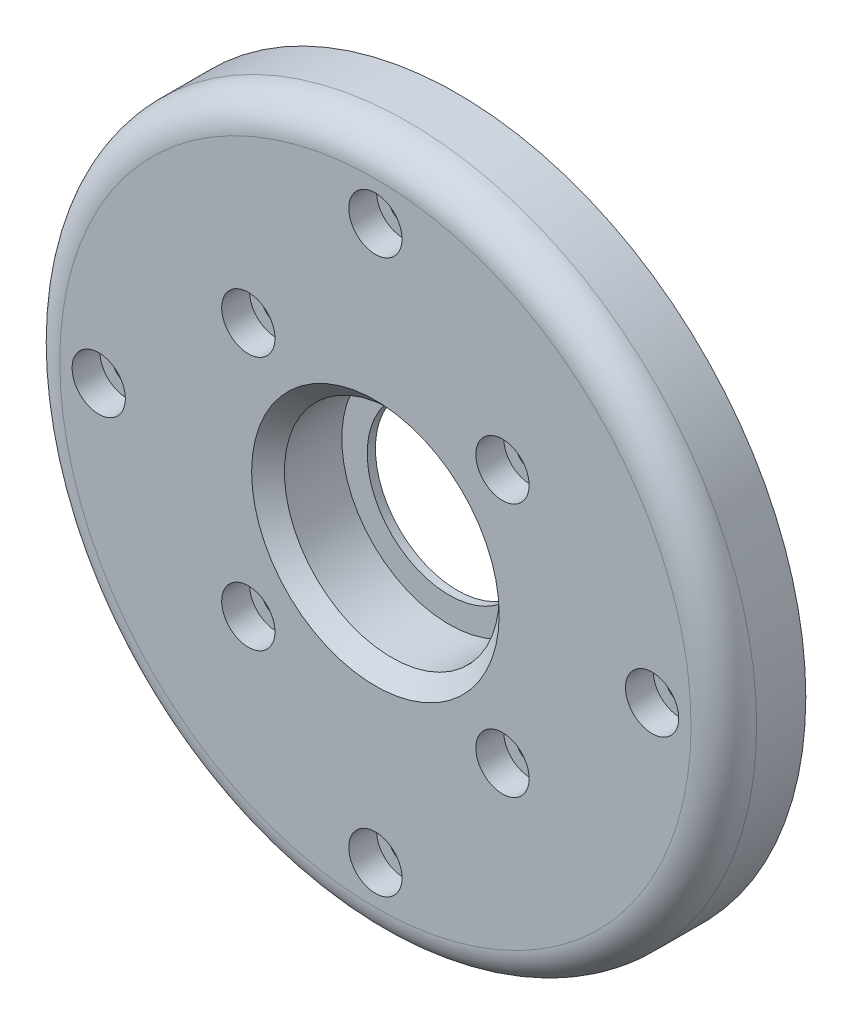
ISO-10303-21;
HEADER;
FILE_DESCRIPTION(('STEP AP214'),'2;1');
FILE_NAME('part.step','',(''),(''),'','','');
FILE_SCHEMA(('AUTOMOTIVE_DESIGN { 1 0 10303 214 1 1 1 1 }'));
ENDSEC;
DATA;
#1=APPLICATION_CONTEXT('core data for automotive mechanical design processes');
#2=APPLICATION_PROTOCOL_DEFINITION('international standard','automotive_design',2000,#1);
#3=PRODUCT_CONTEXT('',#1,'mechanical');
#4=PRODUCT('Part','Part','',(#3));
#5=PRODUCT_RELATED_PRODUCT_CATEGORY('part','',(#4));
#6=PRODUCT_DEFINITION_FORMATION('','',#4);
#7=PRODUCT_DEFINITION_CONTEXT('part definition',#1,'design');
#8=PRODUCT_DEFINITION('design','',#6,#7);
#9=PRODUCT_DEFINITION_SHAPE('','',#8);
#10=(LENGTH_UNIT() NAMED_UNIT(*) SI_UNIT(.MILLI.,.METRE.));
#11=(NAMED_UNIT(*) PLANE_ANGLE_UNIT() SI_UNIT($,.RADIAN.));
#12=(NAMED_UNIT(*) SI_UNIT($,.STERADIAN.) SOLID_ANGLE_UNIT());
#13=UNCERTAINTY_MEASURE_WITH_UNIT(LENGTH_MEASURE(1.E-05),#10,'distance_accuracy_value','');
#14=(GEOMETRIC_REPRESENTATION_CONTEXT(3) GLOBAL_UNCERTAINTY_ASSIGNED_CONTEXT((#13)) GLOBAL_UNIT_ASSIGNED_CONTEXT((#10,
#11,#12)) REPRESENTATION_CONTEXT('',''));
#15=CARTESIAN_POINT('',(0.,0.,0.));
#16=DIRECTION('',(0.,0.,1.));
#17=DIRECTION('',(1.,0.,0.));
#18=AXIS2_PLACEMENT_3D('',#15,#16,#17);
#19=CARTESIAN_POINT('',(0.,0.,-28.2842712474619));
#20=DIRECTION('',(0.,0.,1.));
#21=DIRECTION('',(1.,0.,0.));
#22=AXIS2_PLACEMENT_3D('',#19,#20,#21);
#23=CYLINDRICAL_SURFACE('',#22,10.);
#24=CARTESIAN_POINT('',(0.,0.,0.));
#25=DIRECTION('',(0.,0.,1.));
#26=DIRECTION('',(1.,0.,0.));
#27=AXIS2_PLACEMENT_3D('',#24,#25,#26);
#28=CIRCLE('',#27,10.);
#29=CARTESIAN_POINT('',(10.,0.,0.));
#30=VERTEX_POINT('',#29);
#31=EDGE_CURVE('E68',#30,#30,#28,.F.);
#32=ORIENTED_EDGE('',*,*,#31,.T.);
#33=EDGE_LOOP('',(#32));
#34=FACE_BOUND('',#33,.T.);
#35=CARTESIAN_POINT('',(0.,0.,1.));
#36=DIRECTION('',(0.,0.,1.));
#37=DIRECTION('',(1.,0.,0.));
#38=AXIS2_PLACEMENT_3D('',#35,#36,#37);
#39=CIRCLE('',#38,10.);
#40=CARTESIAN_POINT('',(10.,0.,1.));
#41=VERTEX_POINT('',#40);
#42=EDGE_CURVE('E61',#41,#41,#39,.F.);
#43=ORIENTED_EDGE('',*,*,#42,.F.);
#44=EDGE_LOOP('',(#43));
#45=FACE_BOUND('',#44,.T.);
#46=ADVANCED_FACE('F39',(#34,#45),#23,.F.);
#47=CARTESIAN_POINT('',(0.,0.,10.));
#48=DIRECTION('',(0.,0.,-1.));
#49=DIRECTION('',(-1.,0.,0.));
#50=AXIS2_PLACEMENT_3D('',#47,#48,#49);
#51=CYLINDRICAL_SURFACE('',#50,42.5);
#52=CARTESIAN_POINT('',(0.,0.,6.));
#53=DIRECTION('',(0.,0.,1.));
#54=DIRECTION('',(1.,0.,0.));
#55=AXIS2_PLACEMENT_3D('',#52,#53,#54);
#56=CIRCLE('',#55,42.5);
#57=CARTESIAN_POINT('',(42.5,0.,6.));
#58=VERTEX_POINT('',#57);
#59=EDGE_CURVE('E51',#58,#58,#56,.F.);
#60=ORIENTED_EDGE('',*,*,#59,.T.);
#61=EDGE_LOOP('',(#60));
#62=FACE_BOUND('',#61,.T.);
#63=CARTESIAN_POINT('',(0.,0.,0.));
#64=DIRECTION('',(0.,0.,1.));
#65=DIRECTION('',(1.,0.,0.));
#66=AXIS2_PLACEMENT_3D('',#63,#64,#65);
#67=CIRCLE('',#66,42.5);
#68=CARTESIAN_POINT('',(42.5,0.,0.));
#69=VERTEX_POINT('',#68);
#70=EDGE_CURVE('E60',#69,#69,#67,.T.);
#71=ORIENTED_EDGE('',*,*,#70,.T.);
#72=EDGE_LOOP('',(#71));
#73=FACE_BOUND('',#72,.T.);
#74=ADVANCED_FACE('F187',(#62,#73),#51,.T.);
#75=CARTESIAN_POINT('',(0.,0.,10.));
#76=DIRECTION('',(0.,0.,1.));
#77=DIRECTION('',(1.,0.,0.));
#78=AXIS2_PLACEMENT_3D('',#75,#76,#77);
#79=PLANE('',#78);
#80=CARTESIAN_POINT('',(0.,0.,10.));
#81=DIRECTION('',(0.,0.,1.));
#82=DIRECTION('',(1.,0.,0.));
#83=AXIS2_PLACEMENT_3D('',#80,#81,#82);
#84=CIRCLE('',#83,15.1);
#85=CARTESIAN_POINT('',(15.1,0.,10.));
#86=VERTEX_POINT('',#85);
#87=EDGE_CURVE('E10',#86,#86,#84,.F.);
#88=ORIENTED_EDGE('',*,*,#87,.T.);
#89=EDGE_LOOP('',(#88));
#90=FACE_BOUND('',#89,.T.);
#91=CARTESIAN_POINT('',(0.,0.,10.));
#92=DIRECTION('',(0.,0.,1.));
#93=DIRECTION('',(1.,0.,0.));
#94=AXIS2_PLACEMENT_3D('',#91,#92,#93);
#95=CIRCLE('',#94,38.5);
#96=CARTESIAN_POINT('',(38.5,0.,10.));
#97=VERTEX_POINT('',#96);
#98=EDGE_CURVE('E55',#97,#97,#95,.T.);
#99=ORIENTED_EDGE('',*,*,#98,.T.);
#100=EDGE_LOOP('',(#99));
#101=FACE_BOUND('',#100,.T.);
#102=CARTESIAN_POINT('',(-3.49379302610745E-13,-33.75,10.));
#103=DIRECTION('',(0.,0.,1.));
#104=DIRECTION('',(0.,1.,0.));
#105=AXIS2_PLACEMENT_3D('',#102,#103,#104);
#106=CIRCLE('',#105,3.25);
#107=CARTESIAN_POINT('',(-3.15337359557024E-13,-30.5,10.));
#108=VERTEX_POINT('',#107);
#109=EDGE_CURVE('E102',#108,#108,#106,.T.);
#110=ORIENTED_EDGE('',*,*,#109,.F.);
#111=EDGE_LOOP('',(#110));
#112=FACE_BOUND('',#111,.T.);
#113=CARTESIAN_POINT('',(1.13704312238833E-13,33.75,10.));
#114=DIRECTION('',(0.,0.,1.));
#115=DIRECTION('',(0.,-1.,0.));
#116=AXIS2_PLACEMENT_3D('',#113,#114,#115);
#117=CIRCLE('',#116,3.25);
#118=CARTESIAN_POINT('',(1.02356997887593E-13,30.5,10.));
#119=VERTEX_POINT('',#118);
#120=EDGE_CURVE('E117',#119,#119,#117,.T.);
#121=ORIENTED_EDGE('',*,*,#120,.F.);
#122=EDGE_LOOP('',(#121));
#123=FACE_BOUND('',#122,.T.);
#124=CARTESIAN_POINT('',(15.5,-15.5,10.));
#125=DIRECTION('',(0.,0.,1.));
#126=DIRECTION('',(-1.,0.,0.));
#127=AXIS2_PLACEMENT_3D('',#124,#125,#126);
#128=CIRCLE('',#127,3.25);
#129=CARTESIAN_POINT('',(12.25,-15.5,10.));
#130=VERTEX_POINT('',#129);
#131=EDGE_CURVE('E110',#130,#130,#128,.T.);
#132=ORIENTED_EDGE('',*,*,#131,.F.);
#133=EDGE_LOOP('',(#132));
#134=FACE_BOUND('',#133,.T.);
#135=CARTESIAN_POINT('',(33.75,0.,10.));
#136=DIRECTION('',(0.,0.,1.));
#137=DIRECTION('',(-1.,0.,0.));
#138=AXIS2_PLACEMENT_3D('',#135,#136,#137);
#139=CIRCLE('',#138,3.25);
#140=CARTESIAN_POINT('',(30.5,0.,10.));
#141=VERTEX_POINT('',#140);
#142=EDGE_CURVE('E127',#141,#141,#139,.T.);
#143=ORIENTED_EDGE('',*,*,#142,.F.);
#144=EDGE_LOOP('',(#143));
#145=FACE_BOUND('',#144,.T.);
#146=CARTESIAN_POINT('',(-15.5000000000002,-15.4999999999998,10.));
#147=DIRECTION('',(0.,0.,1.));
#148=DIRECTION('',(0.,1.,0.));
#149=AXIS2_PLACEMENT_3D('',#146,#147,#148);
#150=CIRCLE('',#149,3.25);
#151=CARTESIAN_POINT('',(-15.5000000000001,-12.2499999999998,10.));
#152=VERTEX_POINT('',#151);
#153=EDGE_CURVE('E109',#152,#152,#150,.T.);
#154=ORIENTED_EDGE('',*,*,#153,.F.);
#155=EDGE_LOOP('',(#154));
#156=FACE_BOUND('',#155,.T.);
#157=CARTESIAN_POINT('',(15.5000000000001,15.4999999999999,10.));
#158=DIRECTION('',(0.,0.,1.));
#159=DIRECTION('',(0.,-1.,0.));
#160=AXIS2_PLACEMENT_3D('',#157,#158,#159);
#161=CIRCLE('',#160,3.25);
#162=CARTESIAN_POINT('',(15.5,12.2499999999999,10.));
#163=VERTEX_POINT('',#162);
#164=EDGE_CURVE('E96',#163,#163,#161,.T.);
#165=ORIENTED_EDGE('',*,*,#164,.F.);
#166=EDGE_LOOP('',(#165));
#167=FACE_BOUND('',#166,.T.);
#168=CARTESIAN_POINT('',(-15.5,15.5,10.));
#169=DIRECTION('',(0.,0.,1.));
#170=DIRECTION('',(1.,0.,0.));
#171=AXIS2_PLACEMENT_3D('',#168,#169,#170);
#172=CIRCLE('',#171,3.25);
#173=CARTESIAN_POINT('',(-12.25,15.5,10.));
#174=VERTEX_POINT('',#173);
#175=EDGE_CURVE('E79',#174,#174,#172,.T.);
#176=ORIENTED_EDGE('',*,*,#175,.F.);
#177=EDGE_LOOP('',(#176));
#178=FACE_BOUND('',#177,.T.);
#179=CARTESIAN_POINT('',(-33.75,0.,10.));
#180=DIRECTION('',(0.,0.,1.));
#181=DIRECTION('',(1.,0.,0.));
#182=AXIS2_PLACEMENT_3D('',#179,#180,#181);
#183=CIRCLE('',#182,3.25);
#184=CARTESIAN_POINT('',(-30.5,0.,10.));
#185=VERTEX_POINT('',#184);
#186=EDGE_CURVE('E75',#185,#185,#183,.T.);
#187=ORIENTED_EDGE('',*,*,#186,.F.);
#188=EDGE_LOOP('',(#187));
#189=FACE_BOUND('',#188,.T.);
#190=ADVANCED_FACE('F194',(#90,#101,#112,#123,#134,#145,#156,#167,#178,#189),#79,.T.);
#191=CARTESIAN_POINT('',(0.,0.,0.));
#192=DIRECTION('',(0.,0.,1.));
#193=DIRECTION('',(1.,0.,0.));
#194=AXIS2_PLACEMENT_3D('',#191,#192,#193);
#195=PLANE('',#194);
#196=CARTESIAN_POINT('',(-3.49379302610745E-13,-33.75,0.));
#197=DIRECTION('',(0.,0.,1.));
#198=DIRECTION('',(1.,0.,0.));
#199=AXIS2_PLACEMENT_3D('',#196,#197,#198);
#200=CIRCLE('',#199,1.7);
#201=CARTESIAN_POINT('',(1.69999999999965,-33.75,0.));
#202=VERTEX_POINT('',#201);
#203=EDGE_CURVE('E138',#202,#202,#200,.F.);
#204=ORIENTED_EDGE('',*,*,#203,.F.);
#205=EDGE_LOOP('',(#204));
#206=FACE_BOUND('',#205,.T.);
#207=CARTESIAN_POINT('',(1.13704312238833E-13,33.75,0.));
#208=DIRECTION('',(0.,0.,1.));
#209=DIRECTION('',(1.,0.,0.));
#210=AXIS2_PLACEMENT_3D('',#207,#208,#209);
#211=CIRCLE('',#210,1.7);
#212=CARTESIAN_POINT('',(1.70000000000011,33.75,0.));
#213=VERTEX_POINT('',#212);
#214=EDGE_CURVE('E137',#213,#213,#211,.F.);
#215=ORIENTED_EDGE('',*,*,#214,.F.);
#216=EDGE_LOOP('',(#215));
#217=FACE_BOUND('',#216,.T.);
#218=CARTESIAN_POINT('',(15.5,-15.5,0.));
#219=DIRECTION('',(0.,0.,1.));
#220=DIRECTION('',(1.,0.,0.));
#221=AXIS2_PLACEMENT_3D('',#218,#219,#220);
#222=CIRCLE('',#221,1.7);
#223=CARTESIAN_POINT('',(17.2,-15.5,0.));
#224=VERTEX_POINT('',#223);
#225=EDGE_CURVE('E144',#224,#224,#222,.F.);
#226=ORIENTED_EDGE('',*,*,#225,.F.);
#227=EDGE_LOOP('',(#226));
#228=FACE_BOUND('',#227,.T.);
#229=CARTESIAN_POINT('',(33.75,0.,0.));
#230=DIRECTION('',(0.,0.,1.));
#231=DIRECTION('',(1.,0.,0.));
#232=AXIS2_PLACEMENT_3D('',#229,#230,#231);
#233=CIRCLE('',#232,1.7);
#234=CARTESIAN_POINT('',(35.45,0.,0.));
#235=VERTEX_POINT('',#234);
#236=EDGE_CURVE('E151',#235,#235,#233,.F.);
#237=ORIENTED_EDGE('',*,*,#236,.F.);
#238=EDGE_LOOP('',(#237));
#239=FACE_BOUND('',#238,.T.);
#240=CARTESIAN_POINT('',(-15.5000000000002,-15.4999999999998,0.));
#241=DIRECTION('',(0.,0.,1.));
#242=DIRECTION('',(1.,0.,0.));
#243=AXIS2_PLACEMENT_3D('',#240,#241,#242);
#244=CIRCLE('',#243,1.7);
#245=CARTESIAN_POINT('',(-13.8000000000002,-15.4999999999998,0.));
#246=VERTEX_POINT('',#245);
#247=EDGE_CURVE('E156',#246,#246,#244,.F.);
#248=ORIENTED_EDGE('',*,*,#247,.F.);
#249=EDGE_LOOP('',(#248));
#250=FACE_BOUND('',#249,.T.);
#251=CARTESIAN_POINT('',(15.5000000000001,15.4999999999999,0.));
#252=DIRECTION('',(0.,0.,1.));
#253=DIRECTION('',(1.,0.,0.));
#254=AXIS2_PLACEMENT_3D('',#251,#252,#253);
#255=CIRCLE('',#254,1.7);
#256=CARTESIAN_POINT('',(17.2000000000001,15.4999999999999,0.));
#257=VERTEX_POINT('',#256);
#258=EDGE_CURVE('E106',#257,#257,#255,.F.);
#259=ORIENTED_EDGE('',*,*,#258,.F.);
#260=EDGE_LOOP('',(#259));
#261=FACE_BOUND('',#260,.T.);
#262=CARTESIAN_POINT('',(-15.5,15.5,0.));
#263=DIRECTION('',(0.,0.,1.));
#264=DIRECTION('',(1.,0.,0.));
#265=AXIS2_PLACEMENT_3D('',#262,#263,#264);
#266=CIRCLE('',#265,1.7);
#267=CARTESIAN_POINT('',(-13.8,15.5,0.));
#268=VERTEX_POINT('',#267);
#269=EDGE_CURVE('E76',#268,#268,#266,.F.);
#270=ORIENTED_EDGE('',*,*,#269,.F.);
#271=EDGE_LOOP('',(#270));
#272=FACE_BOUND('',#271,.T.);
#273=CARTESIAN_POINT('',(-33.75,0.,0.));
#274=DIRECTION('',(0.,0.,1.));
#275=DIRECTION('',(1.,0.,0.));
#276=AXIS2_PLACEMENT_3D('',#273,#274,#275);
#277=CIRCLE('',#276,1.7);
#278=CARTESIAN_POINT('',(-32.05,0.,0.));
#279=VERTEX_POINT('',#278);
#280=EDGE_CURVE('E88',#279,#279,#277,.F.);
#281=ORIENTED_EDGE('',*,*,#280,.F.);
#282=EDGE_LOOP('',(#281));
#283=FACE_BOUND('',#282,.T.);
#284=ORIENTED_EDGE('',*,*,#31,.F.);
#285=EDGE_LOOP('',(#284));
#286=FACE_BOUND('',#285,.T.);
#287=ORIENTED_EDGE('',*,*,#70,.F.);
#288=EDGE_LOOP('',(#287));
#289=FACE_BOUND('',#288,.T.);
#290=ADVANCED_FACE('F203',(#206,#217,#228,#239,#250,#261,#272,#283,#286,#289),#195,.F.);
#291=CARTESIAN_POINT('',(-33.75,0.,6.6));
#292=DIRECTION('',(0.,0.,1.));
#293=DIRECTION('',(1.,0.,0.));
#294=AXIS2_PLACEMENT_3D('',#291,#292,#293);
#295=CYLINDRICAL_SURFACE('',#294,3.25);
#296=CARTESIAN_POINT('',(-33.75,0.,6.6));
#297=DIRECTION('',(0.,0.,1.));
#298=DIRECTION('',(1.,0.,0.));
#299=AXIS2_PLACEMENT_3D('',#296,#297,#298);
#300=CIRCLE('',#299,3.25);
#301=CARTESIAN_POINT('',(-30.5,0.,6.6));
#302=VERTEX_POINT('',#301);
#303=EDGE_CURVE('E72',#302,#302,#300,.T.);
#304=ORIENTED_EDGE('',*,*,#303,.F.);
#305=EDGE_LOOP('',(#304));
#306=FACE_BOUND('',#305,.T.);
#307=ORIENTED_EDGE('',*,*,#186,.T.);
#308=EDGE_LOOP('',(#307));
#309=FACE_BOUND('',#308,.T.);
#310=ADVANCED_FACE('F205',(#306,#309),#295,.F.);
#311=CARTESIAN_POINT('',(-33.75,0.,6.6));
#312=DIRECTION('',(0.,0.,1.));
#313=DIRECTION('',(1.,0.,0.));
#314=AXIS2_PLACEMENT_3D('',#311,#312,#313);
#315=PLANE('',#314);
#316=CARTESIAN_POINT('',(-33.75,0.,6.6));
#317=DIRECTION('',(0.,0.,1.));
#318=DIRECTION('',(1.,0.,0.));
#319=AXIS2_PLACEMENT_3D('',#316,#317,#318);
#320=CIRCLE('',#319,1.7);
#321=CARTESIAN_POINT('',(-32.05,0.,6.6));
#322=VERTEX_POINT('',#321);
#323=EDGE_CURVE('E84',#322,#322,#320,.T.);
#324=ORIENTED_EDGE('',*,*,#323,.F.);
#325=EDGE_LOOP('',(#324));
#326=FACE_BOUND('',#325,.T.);
#327=ORIENTED_EDGE('',*,*,#303,.T.);
#328=EDGE_LOOP('',(#327));
#329=FACE_BOUND('',#328,.T.);
#330=ADVANCED_FACE('F200',(#326,#329),#315,.T.);
#331=CARTESIAN_POINT('',(-15.5,15.5,6.6));
#332=DIRECTION('',(0.,0.,1.));
#333=DIRECTION('',(1.,0.,0.));
#334=AXIS2_PLACEMENT_3D('',#331,#332,#333);
#335=CYLINDRICAL_SURFACE('',#334,3.25);
#336=CARTESIAN_POINT('',(-15.5,15.5,6.6));
#337=DIRECTION('',(0.,0.,1.));
#338=DIRECTION('',(1.,0.,0.));
#339=AXIS2_PLACEMENT_3D('',#336,#337,#338);
#340=CIRCLE('',#339,3.25);
#341=CARTESIAN_POINT('',(-12.25,15.5,6.6));
#342=VERTEX_POINT('',#341);
#343=EDGE_CURVE('E71',#342,#342,#340,.T.);
#344=ORIENTED_EDGE('',*,*,#343,.F.);
#345=EDGE_LOOP('',(#344));
#346=FACE_BOUND('',#345,.T.);
#347=ORIENTED_EDGE('',*,*,#175,.T.);
#348=EDGE_LOOP('',(#347));
#349=FACE_BOUND('',#348,.T.);
#350=ADVANCED_FACE('F244',(#346,#349),#335,.F.);
#351=CARTESIAN_POINT('',(-15.5,15.5,6.6));
#352=DIRECTION('',(0.,0.,1.));
#353=DIRECTION('',(1.,0.,0.));
#354=AXIS2_PLACEMENT_3D('',#351,#352,#353);
#355=PLANE('',#354);
#356=CARTESIAN_POINT('',(-15.5,15.5,6.6));
#357=DIRECTION('',(0.,0.,1.));
#358=DIRECTION('',(1.,0.,0.));
#359=AXIS2_PLACEMENT_3D('',#356,#357,#358);
#360=CIRCLE('',#359,1.7);
#361=CARTESIAN_POINT('',(-13.8,15.5,6.6));
#362=VERTEX_POINT('',#361);
#363=EDGE_CURVE('E87',#362,#362,#360,.T.);
#364=ORIENTED_EDGE('',*,*,#363,.F.);
#365=EDGE_LOOP('',(#364));
#366=FACE_BOUND('',#365,.T.);
#367=ORIENTED_EDGE('',*,*,#343,.T.);
#368=EDGE_LOOP('',(#367));
#369=FACE_BOUND('',#368,.T.);
#370=ADVANCED_FACE('F238',(#366,#369),#355,.T.);
#371=CARTESIAN_POINT('',(-33.75,0.,-4.80832611206852));
#372=DIRECTION('',(0.,0.,1.));
#373=DIRECTION('',(1.,0.,0.));
#374=AXIS2_PLACEMENT_3D('',#371,#372,#373);
#375=CYLINDRICAL_SURFACE('',#374,1.7);
#376=ORIENTED_EDGE('',*,*,#280,.T.);
#377=EDGE_LOOP('',(#376));
#378=FACE_BOUND('',#377,.T.);
#379=ORIENTED_EDGE('',*,*,#323,.T.);
#380=EDGE_LOOP('',(#379));
#381=FACE_BOUND('',#380,.T.);
#382=ADVANCED_FACE('F234',(#378,#381),#375,.F.);
#383=CARTESIAN_POINT('',(-15.5,15.5,-4.80832611206852));
#384=DIRECTION('',(0.,0.,1.));
#385=DIRECTION('',(1.,0.,0.));
#386=AXIS2_PLACEMENT_3D('',#383,#384,#385);
#387=CYLINDRICAL_SURFACE('',#386,1.7);
#388=ORIENTED_EDGE('',*,*,#269,.T.);
#389=EDGE_LOOP('',(#388));
#390=FACE_BOUND('',#389,.T.);
#391=ORIENTED_EDGE('',*,*,#363,.T.);
#392=EDGE_LOOP('',(#391));
#393=FACE_BOUND('',#392,.T.);
#394=ADVANCED_FACE('F237',(#390,#393),#387,.F.);
#395=CARTESIAN_POINT('',(15.5000000000001,15.4999999999999,6.6));
#396=DIRECTION('',(0.,0.,1.));
#397=DIRECTION('',(1.,0.,0.));
#398=AXIS2_PLACEMENT_3D('',#395,#396,#397);
#399=CYLINDRICAL_SURFACE('',#398,3.25);
#400=CARTESIAN_POINT('',(15.5000000000001,15.4999999999999,6.6));
#401=DIRECTION('',(0.,0.,1.));
#402=DIRECTION('',(0.,-1.,0.));
#403=AXIS2_PLACEMENT_3D('',#400,#401,#402);
#404=CIRCLE('',#403,3.25);
#405=CARTESIAN_POINT('',(15.5,12.2499999999999,6.6));
#406=VERTEX_POINT('',#405);
#407=EDGE_CURVE('E91',#406,#406,#404,.T.);
#408=ORIENTED_EDGE('',*,*,#407,.F.);
#409=EDGE_LOOP('',(#408));
#410=FACE_BOUND('',#409,.T.);
#411=ORIENTED_EDGE('',*,*,#164,.T.);
#412=EDGE_LOOP('',(#411));
#413=FACE_BOUND('',#412,.T.);
#414=ADVANCED_FACE('F263',(#410,#413),#399,.F.);
#415=CARTESIAN_POINT('',(15.5000000000001,15.4999999999999,6.6));
#416=DIRECTION('',(0.,0.,1.));
#417=DIRECTION('',(0.,-1.,0.));
#418=AXIS2_PLACEMENT_3D('',#415,#416,#417);
#419=PLANE('',#418);
#420=CARTESIAN_POINT('',(15.5000000000001,15.4999999999999,6.6));
#421=DIRECTION('',(0.,0.,1.));
#422=DIRECTION('',(0.,-1.,0.));
#423=AXIS2_PLACEMENT_3D('',#420,#421,#422);
#424=CIRCLE('',#423,1.7);
#425=CARTESIAN_POINT('',(15.5000000000001,13.7999999999999,6.6));
#426=VERTEX_POINT('',#425);
#427=EDGE_CURVE('E134',#426,#426,#424,.T.);
#428=ORIENTED_EDGE('',*,*,#427,.F.);
#429=EDGE_LOOP('',(#428));
#430=FACE_BOUND('',#429,.T.);
#431=ORIENTED_EDGE('',*,*,#407,.T.);
#432=EDGE_LOOP('',(#431));
#433=FACE_BOUND('',#432,.T.);
#434=ADVANCED_FACE('F266',(#430,#433),#419,.T.);
#435=CARTESIAN_POINT('',(-15.5000000000002,-15.4999999999998,6.6));
#436=DIRECTION('',(0.,0.,1.));
#437=DIRECTION('',(1.,0.,0.));
#438=AXIS2_PLACEMENT_3D('',#435,#436,#437);
#439=CYLINDRICAL_SURFACE('',#438,3.25);
#440=CARTESIAN_POINT('',(-15.5000000000002,-15.4999999999998,6.6));
#441=DIRECTION('',(0.,0.,1.));
#442=DIRECTION('',(0.,1.,0.));
#443=AXIS2_PLACEMENT_3D('',#440,#441,#442);
#444=CIRCLE('',#443,3.25);
#445=CARTESIAN_POINT('',(-15.5000000000001,-12.2499999999998,6.6));
#446=VERTEX_POINT('',#445);
#447=EDGE_CURVE('E124',#446,#446,#444,.T.);
#448=ORIENTED_EDGE('',*,*,#447,.F.);
#449=EDGE_LOOP('',(#448));
#450=FACE_BOUND('',#449,.T.);
#451=ORIENTED_EDGE('',*,*,#153,.T.);
#452=EDGE_LOOP('',(#451));
#453=FACE_BOUND('',#452,.T.);
#454=ADVANCED_FACE('F270',(#450,#453),#439,.F.);
#455=CARTESIAN_POINT('',(-15.5000000000002,-15.4999999999998,6.6));
#456=DIRECTION('',(0.,0.,1.));
#457=DIRECTION('',(0.,1.,0.));
#458=AXIS2_PLACEMENT_3D('',#455,#456,#457);
#459=PLANE('',#458);
#460=CARTESIAN_POINT('',(-15.5000000000002,-15.4999999999998,6.6));
#461=DIRECTION('',(0.,0.,1.));
#462=DIRECTION('',(0.,1.,0.));
#463=AXIS2_PLACEMENT_3D('',#460,#461,#462);
#464=CIRCLE('',#463,1.7);
#465=CARTESIAN_POINT('',(-15.5000000000001,-13.7999999999998,6.6));
#466=VERTEX_POINT('',#465);
#467=EDGE_CURVE('E141',#466,#466,#464,.T.);
#468=ORIENTED_EDGE('',*,*,#467,.F.);
#469=EDGE_LOOP('',(#468));
#470=FACE_BOUND('',#469,.T.);
#471=ORIENTED_EDGE('',*,*,#447,.T.);
#472=EDGE_LOOP('',(#471));
#473=FACE_BOUND('',#472,.T.);
#474=ADVANCED_FACE('F300',(#470,#473),#459,.T.);
#475=CARTESIAN_POINT('',(33.75,0.,6.6));
#476=DIRECTION('',(0.,0.,1.));
#477=DIRECTION('',(1.,0.,0.));
#478=AXIS2_PLACEMENT_3D('',#475,#476,#477);
#479=CYLINDRICAL_SURFACE('',#478,3.25);
#480=CARTESIAN_POINT('',(33.75,0.,6.6));
#481=DIRECTION('',(0.,0.,1.));
#482=DIRECTION('',(-1.,0.,0.));
#483=AXIS2_PLACEMENT_3D('',#480,#481,#482);
#484=CIRCLE('',#483,3.25);
#485=CARTESIAN_POINT('',(30.5,0.,6.6));
#486=VERTEX_POINT('',#485);
#487=EDGE_CURVE('E114',#486,#486,#484,.T.);
#488=ORIENTED_EDGE('',*,*,#487,.F.);
#489=EDGE_LOOP('',(#488));
#490=FACE_BOUND('',#489,.T.);
#491=ORIENTED_EDGE('',*,*,#142,.T.);
#492=EDGE_LOOP('',(#491));
#493=FACE_BOUND('',#492,.T.);
#494=ADVANCED_FACE('F304',(#490,#493),#479,.F.);
#495=CARTESIAN_POINT('',(33.75,0.,6.6));
#496=DIRECTION('',(0.,0.,1.));
#497=DIRECTION('',(-1.,0.,0.));
#498=AXIS2_PLACEMENT_3D('',#495,#496,#497);
#499=PLANE('',#498);
#500=CARTESIAN_POINT('',(33.75,0.,6.6));
#501=DIRECTION('',(0.,0.,1.));
#502=DIRECTION('',(-1.,0.,0.));
#503=AXIS2_PLACEMENT_3D('',#500,#501,#502);
#504=CIRCLE('',#503,1.7);
#505=CARTESIAN_POINT('',(32.05,0.,6.6));
#506=VERTEX_POINT('',#505);
#507=EDGE_CURVE('E159',#506,#506,#504,.T.);
#508=ORIENTED_EDGE('',*,*,#507,.F.);
#509=EDGE_LOOP('',(#508));
#510=FACE_BOUND('',#509,.T.);
#511=ORIENTED_EDGE('',*,*,#487,.T.);
#512=EDGE_LOOP('',(#511));
#513=FACE_BOUND('',#512,.T.);
#514=ADVANCED_FACE('F286',(#510,#513),#499,.T.);
#515=CARTESIAN_POINT('',(15.5,-15.5,6.6));
#516=DIRECTION('',(0.,0.,1.));
#517=DIRECTION('',(1.,0.,0.));
#518=AXIS2_PLACEMENT_3D('',#515,#516,#517);
#519=CYLINDRICAL_SURFACE('',#518,3.25);
#520=CARTESIAN_POINT('',(15.5,-15.5,6.6));
#521=DIRECTION('',(0.,0.,1.));
#522=DIRECTION('',(-1.,0.,0.));
#523=AXIS2_PLACEMENT_3D('',#520,#521,#522);
#524=CIRCLE('',#523,3.25);
#525=CARTESIAN_POINT('',(12.25,-15.5,6.6));
#526=VERTEX_POINT('',#525);
#527=EDGE_CURVE('E113',#526,#526,#524,.T.);
#528=ORIENTED_EDGE('',*,*,#527,.F.);
#529=EDGE_LOOP('',(#528));
#530=FACE_BOUND('',#529,.T.);
#531=ORIENTED_EDGE('',*,*,#131,.T.);
#532=EDGE_LOOP('',(#531));
#533=FACE_BOUND('',#532,.T.);
#534=ADVANCED_FACE('F282',(#530,#533),#519,.F.);
#535=CARTESIAN_POINT('',(15.5,-15.5,6.6));
#536=DIRECTION('',(0.,0.,1.));
#537=DIRECTION('',(-1.,0.,0.));
#538=AXIS2_PLACEMENT_3D('',#535,#536,#537);
#539=PLANE('',#538);
#540=CARTESIAN_POINT('',(15.5,-15.5,6.6));
#541=DIRECTION('',(0.,0.,1.));
#542=DIRECTION('',(-1.,0.,0.));
#543=AXIS2_PLACEMENT_3D('',#540,#541,#542);
#544=CIRCLE('',#543,1.7);
#545=CARTESIAN_POINT('',(13.8,-15.5,6.6));
#546=VERTEX_POINT('',#545);
#547=EDGE_CURVE('E148',#546,#546,#544,.T.);
#548=ORIENTED_EDGE('',*,*,#547,.F.);
#549=EDGE_LOOP('',(#548));
#550=FACE_BOUND('',#549,.T.);
#551=ORIENTED_EDGE('',*,*,#527,.T.);
#552=EDGE_LOOP('',(#551));
#553=FACE_BOUND('',#552,.T.);
#554=ADVANCED_FACE('F285',(#550,#553),#539,.T.);
#555=CARTESIAN_POINT('',(1.13704312238833E-13,33.75,6.6));
#556=DIRECTION('',(0.,0.,1.));
#557=DIRECTION('',(1.,0.,0.));
#558=AXIS2_PLACEMENT_3D('',#555,#556,#557);
#559=CYLINDRICAL_SURFACE('',#558,3.25);
#560=CARTESIAN_POINT('',(1.13704312238833E-13,33.75,6.6));
#561=DIRECTION('',(0.,0.,1.));
#562=DIRECTION('',(0.,-1.,0.));
#563=AXIS2_PLACEMENT_3D('',#560,#561,#562);
#564=CIRCLE('',#563,3.25);
#565=CARTESIAN_POINT('',(1.02356997887593E-13,30.5,6.6));
#566=VERTEX_POINT('',#565);
#567=EDGE_CURVE('E99',#566,#566,#564,.T.);
#568=ORIENTED_EDGE('',*,*,#567,.F.);
#569=EDGE_LOOP('',(#568));
#570=FACE_BOUND('',#569,.T.);
#571=ORIENTED_EDGE('',*,*,#120,.T.);
#572=EDGE_LOOP('',(#571));
#573=FACE_BOUND('',#572,.T.);
#574=ADVANCED_FACE('F290',(#570,#573),#559,.F.);
#575=CARTESIAN_POINT('',(1.13704312238833E-13,33.75,6.6));
#576=DIRECTION('',(0.,0.,1.));
#577=DIRECTION('',(0.,-1.,0.));
#578=AXIS2_PLACEMENT_3D('',#575,#576,#577);
#579=PLANE('',#578);
#580=CARTESIAN_POINT('',(1.13704312238833E-13,33.75,6.6));
#581=DIRECTION('',(0.,0.,1.));
#582=DIRECTION('',(0.,-1.,0.));
#583=AXIS2_PLACEMENT_3D('',#580,#581,#582);
#584=CIRCLE('',#583,1.7);
#585=CARTESIAN_POINT('',(1.077687939628E-13,32.05,6.6));
#586=VERTEX_POINT('',#585);
#587=EDGE_CURVE('E147',#586,#586,#584,.T.);
#588=ORIENTED_EDGE('',*,*,#587,.F.);
#589=EDGE_LOOP('',(#588));
#590=FACE_BOUND('',#589,.T.);
#591=ORIENTED_EDGE('',*,*,#567,.T.);
#592=EDGE_LOOP('',(#591));
#593=FACE_BOUND('',#592,.T.);
#594=ADVANCED_FACE('F276',(#590,#593),#579,.T.);
#595=CARTESIAN_POINT('',(-3.49379302610745E-13,-33.75,6.6));
#596=DIRECTION('',(0.,0.,1.));
#597=DIRECTION('',(1.,0.,0.));
#598=AXIS2_PLACEMENT_3D('',#595,#596,#597);
#599=CYLINDRICAL_SURFACE('',#598,3.25);
#600=CARTESIAN_POINT('',(-3.49379302610745E-13,-33.75,6.6));
#601=DIRECTION('',(0.,0.,1.));
#602=DIRECTION('',(0.,1.,0.));
#603=AXIS2_PLACEMENT_3D('',#600,#601,#602);
#604=CIRCLE('',#603,3.25);
#605=CARTESIAN_POINT('',(-3.15337359557024E-13,-30.5,6.6));
#606=VERTEX_POINT('',#605);
#607=EDGE_CURVE('E105',#606,#606,#604,.T.);
#608=ORIENTED_EDGE('',*,*,#607,.F.);
#609=EDGE_LOOP('',(#608));
#610=FACE_BOUND('',#609,.T.);
#611=ORIENTED_EDGE('',*,*,#109,.T.);
#612=EDGE_LOOP('',(#611));
#613=FACE_BOUND('',#612,.T.);
#614=ADVANCED_FACE('F272',(#610,#613),#599,.F.);
#615=CARTESIAN_POINT('',(-3.49379302610745E-13,-33.75,6.6));
#616=DIRECTION('',(0.,0.,1.));
#617=DIRECTION('',(0.,1.,0.));
#618=AXIS2_PLACEMENT_3D('',#615,#616,#617);
#619=PLANE('',#618);
#620=CARTESIAN_POINT('',(-3.49379302610745E-13,-33.75,6.6));
#621=DIRECTION('',(0.,0.,1.));
#622=DIRECTION('',(0.,1.,0.));
#623=AXIS2_PLACEMENT_3D('',#620,#621,#622);
#624=CIRCLE('',#623,1.7);
#625=CARTESIAN_POINT('',(-3.31572747782645E-13,-32.05,6.6));
#626=VERTEX_POINT('',#625);
#627=EDGE_CURVE('E64',#626,#626,#624,.T.);
#628=ORIENTED_EDGE('',*,*,#627,.F.);
#629=EDGE_LOOP('',(#628));
#630=FACE_BOUND('',#629,.T.);
#631=ORIENTED_EDGE('',*,*,#607,.T.);
#632=EDGE_LOOP('',(#631));
#633=FACE_BOUND('',#632,.T.);
#634=ADVANCED_FACE('F275',(#630,#633),#619,.T.);
#635=CARTESIAN_POINT('',(15.5000000000001,15.4999999999999,-4.80832611206852));
#636=DIRECTION('',(0.,0.,1.));
#637=DIRECTION('',(1.,0.,0.));
#638=AXIS2_PLACEMENT_3D('',#635,#636,#637);
#639=CYLINDRICAL_SURFACE('',#638,1.7);
#640=ORIENTED_EDGE('',*,*,#258,.T.);
#641=EDGE_LOOP('',(#640));
#642=FACE_BOUND('',#641,.T.);
#643=ORIENTED_EDGE('',*,*,#427,.T.);
#644=EDGE_LOOP('',(#643));
#645=FACE_BOUND('',#644,.T.);
#646=ADVANCED_FACE('F280',(#642,#645),#639,.F.);
#647=CARTESIAN_POINT('',(-15.5000000000002,-15.4999999999998,-4.80832611206852));
#648=DIRECTION('',(0.,0.,1.));
#649=DIRECTION('',(1.,0.,0.));
#650=AXIS2_PLACEMENT_3D('',#647,#648,#649);
#651=CYLINDRICAL_SURFACE('',#650,1.7);
#652=ORIENTED_EDGE('',*,*,#247,.T.);
#653=EDGE_LOOP('',(#652));
#654=FACE_BOUND('',#653,.T.);
#655=ORIENTED_EDGE('',*,*,#467,.T.);
#656=EDGE_LOOP('',(#655));
#657=FACE_BOUND('',#656,.T.);
#658=ADVANCED_FACE('F314',(#654,#657),#651,.F.);
#659=CARTESIAN_POINT('',(33.75,0.,-4.80832611206852));
#660=DIRECTION('',(0.,0.,1.));
#661=DIRECTION('',(1.,0.,0.));
#662=AXIS2_PLACEMENT_3D('',#659,#660,#661);
#663=CYLINDRICAL_SURFACE('',#662,1.7);
#664=ORIENTED_EDGE('',*,*,#236,.T.);
#665=EDGE_LOOP('',(#664));
#666=FACE_BOUND('',#665,.T.);
#667=ORIENTED_EDGE('',*,*,#507,.T.);
#668=EDGE_LOOP('',(#667));
#669=FACE_BOUND('',#668,.T.);
#670=ADVANCED_FACE('F322',(#666,#669),#663,.F.);
#671=CARTESIAN_POINT('',(15.5,-15.5,-4.80832611206852));
#672=DIRECTION('',(0.,0.,1.));
#673=DIRECTION('',(1.,0.,0.));
#674=AXIS2_PLACEMENT_3D('',#671,#672,#673);
#675=CYLINDRICAL_SURFACE('',#674,1.7);
#676=ORIENTED_EDGE('',*,*,#225,.T.);
#677=EDGE_LOOP('',(#676));
#678=FACE_BOUND('',#677,.T.);
#679=ORIENTED_EDGE('',*,*,#547,.T.);
#680=EDGE_LOOP('',(#679));
#681=FACE_BOUND('',#680,.T.);
#682=ADVANCED_FACE('F319',(#678,#681),#675,.F.);
#683=CARTESIAN_POINT('',(1.13704312238833E-13,33.75,-4.80832611206852));
#684=DIRECTION('',(0.,0.,1.));
#685=DIRECTION('',(1.,0.,0.));
#686=AXIS2_PLACEMENT_3D('',#683,#684,#685);
#687=CYLINDRICAL_SURFACE('',#686,1.7);
#688=ORIENTED_EDGE('',*,*,#214,.T.);
#689=EDGE_LOOP('',(#688));
#690=FACE_BOUND('',#689,.T.);
#691=ORIENTED_EDGE('',*,*,#587,.T.);
#692=EDGE_LOOP('',(#691));
#693=FACE_BOUND('',#692,.T.);
#694=ADVANCED_FACE('F317',(#690,#693),#687,.F.);
#695=CARTESIAN_POINT('',(-3.49379302610745E-13,-33.75,-4.80832611206852));
#696=DIRECTION('',(0.,0.,1.));
#697=DIRECTION('',(1.,0.,0.));
#698=AXIS2_PLACEMENT_3D('',#695,#696,#697);
#699=CYLINDRICAL_SURFACE('',#698,1.7);
#700=ORIENTED_EDGE('',*,*,#203,.T.);
#701=EDGE_LOOP('',(#700));
#702=FACE_BOUND('',#701,.T.);
#703=ORIENTED_EDGE('',*,*,#627,.T.);
#704=EDGE_LOOP('',(#703));
#705=FACE_BOUND('',#704,.T.);
#706=ADVANCED_FACE('F183',(#702,#705),#699,.F.);
#707=CARTESIAN_POINT('',(0.,0.,1.));
#708=DIRECTION('',(0.,0.,1.));
#709=DIRECTION('',(1.,0.,0.));
#710=AXIS2_PLACEMENT_3D('',#707,#708,#709);
#711=PLANE('',#710);
#712=CARTESIAN_POINT('',(0.,0.,1.));
#713=DIRECTION('',(0.,0.,1.));
#714=DIRECTION('',(1.,0.,0.));
#715=AXIS2_PLACEMENT_3D('',#712,#713,#714);
#716=CIRCLE('',#715,13.1);
#717=CARTESIAN_POINT('',(13.1,0.,1.));
#718=VERTEX_POINT('',#717);
#719=EDGE_CURVE('E65',#718,#718,#716,.T.);
#720=ORIENTED_EDGE('',*,*,#719,.T.);
#721=EDGE_LOOP('',(#720));
#722=FACE_BOUND('',#721,.T.);
#723=ORIENTED_EDGE('',*,*,#42,.T.);
#724=EDGE_LOOP('',(#723));
#725=FACE_BOUND('',#724,.T.);
#726=ADVANCED_FACE('F169',(#722,#725),#711,.T.);
#727=CARTESIAN_POINT('',(0.,0.,1.));
#728=DIRECTION('',(0.,0.,1.));
#729=DIRECTION('',(1.,0.,0.));
#730=AXIS2_PLACEMENT_3D('',#727,#728,#729);
#731=CYLINDRICAL_SURFACE('',#730,13.1);
#732=CARTESIAN_POINT('',(0.,0.,7.99999999999999));
#733=DIRECTION('',(0.,0.,1.));
#734=DIRECTION('',(1.,0.,0.));
#735=AXIS2_PLACEMENT_3D('',#732,#733,#734);
#736=CIRCLE('',#735,13.1);
#737=CARTESIAN_POINT('',(13.1,0.,7.99999999999999));
#738=VERTEX_POINT('',#737);
#739=EDGE_CURVE('E47',#738,#738,#736,.T.);
#740=ORIENTED_EDGE('',*,*,#739,.T.);
#741=EDGE_LOOP('',(#740));
#742=FACE_BOUND('',#741,.T.);
#743=ORIENTED_EDGE('',*,*,#719,.F.);
#744=EDGE_LOOP('',(#743));
#745=FACE_BOUND('',#744,.T.);
#746=ADVANCED_FACE('F172',(#742,#745),#731,.F.);
#747=CARTESIAN_POINT('',(0.,0.,6.));
#748=DIRECTION('',(0.,0.,1.));
#749=DIRECTION('',(1.,0.,0.));
#750=AXIS2_PLACEMENT_3D('',#747,#748,#749);
#751=TOROIDAL_SURFACE('',#750,38.5,4.);
#752=ORIENTED_EDGE('',*,*,#59,.F.);
#753=EDGE_LOOP('',(#752));
#754=FACE_BOUND('',#753,.T.);
#755=ORIENTED_EDGE('',*,*,#98,.F.);
#756=EDGE_LOOP('',(#755));
#757=FACE_BOUND('',#756,.T.);
#758=ADVANCED_FACE('F174',(#754,#757),#751,.T.);
#759=CARTESIAN_POINT('',(0.,0.,7.99999999999999));
#760=DIRECTION('',(0.,0.,1.));
#761=DIRECTION('',(1.,0.,0.));
#762=AXIS2_PLACEMENT_3D('',#759,#760,#761);
#763=CONICAL_SURFACE('',#762,13.1,0.78539816339745);
#764=ORIENTED_EDGE('',*,*,#87,.F.);
#765=EDGE_LOOP('',(#764));
#766=FACE_BOUND('',#765,.T.);
#767=ORIENTED_EDGE('',*,*,#739,.F.);
#768=EDGE_LOOP('',(#767));
#769=FACE_BOUND('',#768,.T.);
#770=ADVANCED_FACE('F42',(#766,#769),#763,.F.);
#771=CLOSED_SHELL('',(#46,#74,#190,#290,#310,#330,#350,#370,#382,#394,#414,#434,#454,#474,#494,
#514,#534,#554,#574,#594,#614,#634,#646,#658,#670,#682,#694,#706,#726,#746,#758,#770));
#772=MANIFOLD_SOLID_BREP('B2',#771);
#773=ADVANCED_BREP_SHAPE_REPRESENTATION('',(#18,#772),#14);
#774=SHAPE_DEFINITION_REPRESENTATION(#9,#773);
ENDSEC;
END-ISO-10303-21;
